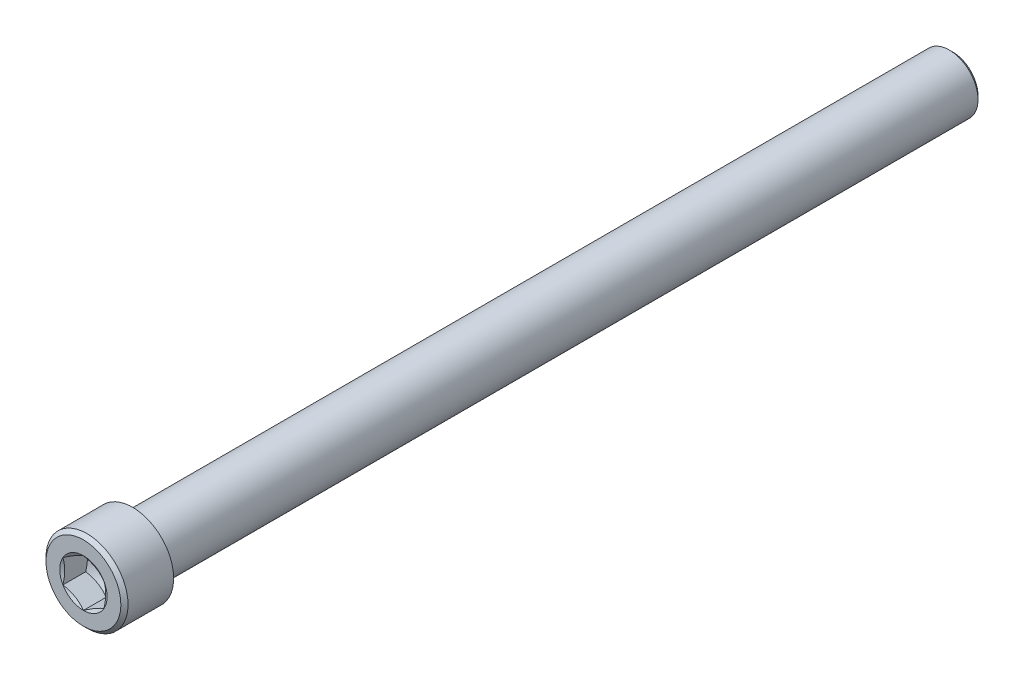
ISO-10303-21;
HEADER;
FILE_DESCRIPTION(('STEP AP214'),'2;1');
FILE_NAME('part.step','',(''),(''),'','','');
FILE_SCHEMA(('AUTOMOTIVE_DESIGN { 1 0 10303 214 1 1 1 1 }'));
ENDSEC;
DATA;
#1=APPLICATION_CONTEXT('core data for automotive mechanical design processes');
#2=APPLICATION_PROTOCOL_DEFINITION('international standard','automotive_design',2000,#1);
#3=PRODUCT_CONTEXT('',#1,'mechanical');
#4=PRODUCT('Part','Part','',(#3));
#5=PRODUCT_RELATED_PRODUCT_CATEGORY('part','',(#4));
#6=PRODUCT_DEFINITION_FORMATION('','',#4);
#7=PRODUCT_DEFINITION_CONTEXT('part definition',#1,'design');
#8=PRODUCT_DEFINITION('design','',#6,#7);
#9=PRODUCT_DEFINITION_SHAPE('','',#8);
#10=(LENGTH_UNIT() NAMED_UNIT(*) SI_UNIT(.MILLI.,.METRE.));
#11=(NAMED_UNIT(*) PLANE_ANGLE_UNIT() SI_UNIT($,.RADIAN.));
#12=(NAMED_UNIT(*) SI_UNIT($,.STERADIAN.) SOLID_ANGLE_UNIT());
#13=UNCERTAINTY_MEASURE_WITH_UNIT(LENGTH_MEASURE(1.E-05),#10,'distance_accuracy_value','');
#14=(GEOMETRIC_REPRESENTATION_CONTEXT(3) GLOBAL_UNCERTAINTY_ASSIGNED_CONTEXT((#13)) GLOBAL_UNIT_ASSIGNED_CONTEXT((#10,
#11,#12)) REPRESENTATION_CONTEXT('',''));
#15=CARTESIAN_POINT('',(0.,0.,0.));
#16=DIRECTION('',(0.,0.,1.));
#17=DIRECTION('',(1.,0.,0.));
#18=AXIS2_PLACEMENT_3D('',#15,#16,#17);
#19=CARTESIAN_POINT('',(0.,10.,12.));
#20=DIRECTION('',(0.,0.,-1.));
#21=DIRECTION('',(0.,1.,0.));
#22=AXIS2_PLACEMENT_3D('',#19,#20,#21);
#23=PLANE('',#22);
#24=CARTESIAN_POINT('',(0.,0.,12.));
#25=DIRECTION('',(0.,0.,-1.));
#26=DIRECTION('',(0.,1.,0.));
#27=AXIS2_PLACEMENT_3D('',#24,#25,#26);
#28=CIRCLE('',#27,9.12499999999997);
#29=CARTESIAN_POINT('',(0.,9.12499999999997,12.));
#30=VERTEX_POINT('',#29);
#31=EDGE_CURVE('E290',#30,#30,#28,.F.);
#32=ORIENTED_EDGE('',*,*,#31,.T.);
#33=EDGE_LOOP('',(#32));
#34=FACE_BOUND('',#33,.T.);
#35=CARTESIAN_POINT('',(0.,0.,12.));
#36=DIRECTION('',(0.,0.,-1.));
#37=DIRECTION('',(0.,1.,0.));
#38=AXIS2_PLACEMENT_3D('',#35,#36,#37);
#39=CIRCLE('',#38,5.77350269189626);
#40=CARTESIAN_POINT('',(0.,5.77350269189626,12.));
#41=VERTEX_POINT('',#40);
#42=CARTESIAN_POINT('',(-5.,2.88675134594813,12.));
#43=VERTEX_POINT('',#42);
#44=EDGE_CURVE('E114',#41,#43,#39,.F.);
#45=ORIENTED_EDGE('',*,*,#44,.F.);
#46=CARTESIAN_POINT('',(5.,2.88675134594813,12.));
#47=VERTEX_POINT('',#46);
#48=EDGE_CURVE('E103',#47,#41,#39,.F.);
#49=ORIENTED_EDGE('',*,*,#48,.F.);
#50=CARTESIAN_POINT('',(5.,-2.88675134594813,12.));
#51=VERTEX_POINT('',#50);
#52=EDGE_CURVE('E112',#51,#47,#39,.F.);
#53=ORIENTED_EDGE('',*,*,#52,.F.);
#54=CARTESIAN_POINT('',(0.,-5.77350269189626,12.));
#55=VERTEX_POINT('',#54);
#56=EDGE_CURVE('E468',#55,#51,#39,.F.);
#57=ORIENTED_EDGE('',*,*,#56,.F.);
#58=CARTESIAN_POINT('',(-5.,-2.88675134594813,12.));
#59=VERTEX_POINT('',#58);
#60=EDGE_CURVE('E142',#59,#55,#39,.F.);
#61=ORIENTED_EDGE('',*,*,#60,.F.);
#62=EDGE_CURVE('E141',#43,#59,#39,.F.);
#63=ORIENTED_EDGE('',*,*,#62,.F.);
#64=EDGE_LOOP('',(#45,#49,#53,#57,#61,#63));
#65=FACE_BOUND('',#64,.T.);
#66=ADVANCED_FACE('F47',(#34,#65),#23,.F.);
#67=CARTESIAN_POINT('',(0.,6.99999999999998,0.));
#68=DIRECTION('',(0.,0.,1.));
#69=DIRECTION('',(0.,-1.,0.));
#70=AXIS2_PLACEMENT_3D('',#67,#68,#69);
#71=PLANE('',#70);
#72=CARTESIAN_POINT('',(0.,0.,0.));
#73=DIRECTION('',(0.,0.,1.));
#74=DIRECTION('',(0.,-1.,0.));
#75=AXIS2_PLACEMENT_3D('',#72,#73,#74);
#76=CIRCLE('',#75,7.59999999999999);
#77=CARTESIAN_POINT('',(0.,-7.59999999999999,0.));
#78=VERTEX_POINT('',#77);
#79=EDGE_CURVE('E55',#78,#78,#76,.T.);
#80=ORIENTED_EDGE('',*,*,#79,.T.);
#81=EDGE_LOOP('',(#80));
#82=FACE_BOUND('',#81,.T.);
#83=CARTESIAN_POINT('',(0.,0.,0.));
#84=DIRECTION('',(0.,0.,1.));
#85=DIRECTION('',(0.,-1.,0.));
#86=AXIS2_PLACEMENT_3D('',#83,#84,#85);
#87=CIRCLE('',#86,10.);
#88=CARTESIAN_POINT('',(0.,-10.,0.));
#89=VERTEX_POINT('',#88);
#90=EDGE_CURVE('E447',#89,#89,#87,.T.);
#91=ORIENTED_EDGE('',*,*,#90,.F.);
#92=EDGE_LOOP('',(#91));
#93=FACE_BOUND('',#92,.T.);
#94=ADVANCED_FACE('F252',(#82,#93),#71,.F.);
#95=CARTESIAN_POINT('',(0.,0.,12.));
#96=DIRECTION('',(0.,0.,1.));
#97=DIRECTION('',(0.,-1.,0.));
#98=AXIS2_PLACEMENT_3D('',#95,#96,#97);
#99=CYLINDRICAL_SURFACE('',#98,6.99999999999999);
#100=CARTESIAN_POINT('',(0.,0.,-0.6));
#101=DIRECTION('',(0.,0.,1.));
#102=DIRECTION('',(0.,-1.,0.));
#103=AXIS2_PLACEMENT_3D('',#100,#101,#102);
#104=CIRCLE('',#103,6.99999999999999);
#105=CARTESIAN_POINT('',(0.,-6.99999999999999,-0.6));
#106=VERTEX_POINT('',#105);
#107=EDGE_CURVE('E12',#106,#106,#104,.F.);
#108=ORIENTED_EDGE('',*,*,#107,.T.);
#109=EDGE_LOOP('',(#108));
#110=FACE_BOUND('',#109,.T.);
#111=CARTESIAN_POINT('',(0.,0.,-199.125));
#112=DIRECTION('',(0.,0.,1.));
#113=DIRECTION('',(0.,-1.,0.));
#114=AXIS2_PLACEMENT_3D('',#111,#112,#113);
#115=CIRCLE('',#114,6.99999999999999);
#116=CARTESIAN_POINT('',(0.,-6.99999999999999,-199.125));
#117=VERTEX_POINT('',#116);
#118=EDGE_CURVE('E284',#117,#117,#115,.T.);
#119=ORIENTED_EDGE('',*,*,#118,.T.);
#120=EDGE_LOOP('',(#119));
#121=FACE_BOUND('',#120,.T.);
#122=ADVANCED_FACE('F258',(#110,#121),#99,.T.);
#123=CARTESIAN_POINT('',(0.,0.,-200.));
#124=DIRECTION('',(0.,0.,1.));
#125=DIRECTION('',(0.,-1.,0.));
#126=AXIS2_PLACEMENT_3D('',#123,#124,#125);
#127=PLANE('',#126);
#128=CARTESIAN_POINT('',(0.,0.,-200.));
#129=DIRECTION('',(0.,0.,1.));
#130=DIRECTION('',(0.,-1.,0.));
#131=AXIS2_PLACEMENT_3D('',#128,#129,#130);
#132=CIRCLE('',#131,6.12499999999999);
#133=CARTESIAN_POINT('',(0.,-6.12499999999999,-200.));
#134=VERTEX_POINT('',#133);
#135=EDGE_CURVE('E124',#134,#134,#132,.F.);
#136=ORIENTED_EDGE('',*,*,#135,.T.);
#137=EDGE_LOOP('',(#136));
#138=FACE_BOUND('',#137,.T.);
#139=ADVANCED_FACE('F263',(#138),#127,.F.);
#140=CARTESIAN_POINT('',(0.,0.,12.));
#141=DIRECTION('',(0.,0.,1.));
#142=DIRECTION('',(0.,-1.,0.));
#143=AXIS2_PLACEMENT_3D('',#140,#141,#142);
#144=CYLINDRICAL_SURFACE('',#143,10.);
#145=CARTESIAN_POINT('',(0.,0.,11.125));
#146=DIRECTION('',(0.,0.,-1.));
#147=DIRECTION('',(0.,1.,0.));
#148=AXIS2_PLACEMENT_3D('',#145,#146,#147);
#149=CIRCLE('',#148,10.);
#150=CARTESIAN_POINT('',(0.,10.,11.125));
#151=VERTEX_POINT('',#150);
#152=EDGE_CURVE('E286',#151,#151,#149,.T.);
#153=ORIENTED_EDGE('',*,*,#152,.T.);
#154=EDGE_LOOP('',(#153));
#155=FACE_BOUND('',#154,.T.);
#156=ORIENTED_EDGE('',*,*,#90,.T.);
#157=EDGE_LOOP('',(#156));
#158=FACE_BOUND('',#157,.T.);
#159=ADVANCED_FACE('F176',(#155,#158),#144,.T.);
#160=CARTESIAN_POINT('',(0.,0.,12.));
#161=DIRECTION('',(0.,0.,-1.));
#162=DIRECTION('',(0.,1.,0.));
#163=AXIS2_PLACEMENT_3D('',#160,#161,#162);
#164=CONICAL_SURFACE('',#163,9.12499999999997,0.785398163397448);
#165=ORIENTED_EDGE('',*,*,#152,.F.);
#166=EDGE_LOOP('',(#165));
#167=FACE_BOUND('',#166,.T.);
#168=ORIENTED_EDGE('',*,*,#31,.F.);
#169=EDGE_LOOP('',(#168));
#170=FACE_BOUND('',#169,.T.);
#171=ADVANCED_FACE('F270',(#167,#170),#164,.T.);
#172=CARTESIAN_POINT('',(0.,0.,-199.125));
#173=DIRECTION('',(0.,0.,1.));
#174=DIRECTION('',(0.,-1.,0.));
#175=AXIS2_PLACEMENT_3D('',#172,#173,#174);
#176=CONICAL_SURFACE('',#175,6.99999999999999,0.785398163397453);
#177=ORIENTED_EDGE('',*,*,#135,.F.);
#178=EDGE_LOOP('',(#177));
#179=FACE_BOUND('',#178,.T.);
#180=ORIENTED_EDGE('',*,*,#118,.F.);
#181=EDGE_LOOP('',(#180));
#182=FACE_BOUND('',#181,.T.);
#183=ADVANCED_FACE('F272',(#179,#182),#176,.T.);
#184=CARTESIAN_POINT('',(0.,0.,11.5534180126148));
#185=DIRECTION('',(0.,0.,1.));
#186=DIRECTION('',(0.,-1.,0.));
#187=AXIS2_PLACEMENT_3D('',#184,#185,#186);
#188=CONICAL_SURFACE('',#187,5.,1.04719755119659);
#189=ORIENTED_EDGE('',*,*,#44,.T.);
#190=CARTESIAN_POINT('',(-5.0002,2.88663587589429,12.0000666686666));
#191=CARTESIAN_POINT('',(-4.78046540547481,3.01349970319368,11.9268045802524));
#192=CARTESIAN_POINT('',(-4.55885141554042,3.14144859993849,11.8601693345329));
#193=CARTESIAN_POINT('',(-4.11178600454648,3.39956193532121,11.7438570036256));
#194=CARTESIAN_POINT('',(-3.88632664040922,3.52973095989718,11.6942210625306));
#195=CARTESIAN_POINT('',(-3.43816769477649,3.78847564779798,11.6169690380335));
#196=CARTESIAN_POINT('',(-3.2155379068958,3.91701101576052,11.5888383908983));
#197=CARTESIAN_POINT('',(-2.88081009815335,4.11026620624323,11.5636129345685));
#198=CARTESIAN_POINT('',(-2.76915780319493,4.17472868879311,11.5580314723843));
#199=CARTESIAN_POINT('',(-2.5457500293262,4.30371322717528,11.5526202293663));
#200=CARTESIAN_POINT('',(-2.43399455370968,4.36823528110589,11.552790270873));
#201=CARTESIAN_POINT('',(-2.12781576914935,4.54500768479195,11.5611716444068));
#202=CARTESIAN_POINT('',(-1.93349391403278,4.65719946015293,11.575247784512));
#203=CARTESIAN_POINT('',(-1.54613989800229,4.88083840557982,11.6198832697242));
#204=CARTESIAN_POINT('',(-1.35310909862842,4.99228478956021,11.6504578727623));
#205=CARTESIAN_POINT('',(-0.964974657525141,5.21637431361295,11.726886506236));
#206=CARTESIAN_POINT('',(-0.76992000135826,5.32898917185759,11.7730643914935));
#207=CARTESIAN_POINT('',(-0.382719654641229,5.55253939626498,11.8778698071067));
#208=CARTESIAN_POINT('',(-0.190569004591911,5.66347762579592,11.9364727160522));
#209=CARTESIAN_POINT('',(0.000200000000001268,5.7736181619501,12.0000666686666));
#210=B_SPLINE_CURVE_WITH_KNOTS('',3,(#190,#191,#192,#193,#194,#195,#196,#197,#198,#199,#200,
#201,#202,#203,#204,#205,#206,#207,#208,#209),.UNSPECIFIED.,.F.,.F.,(4,2,2,2,2,2,2,2,2,4),(0.,
0.792555841363093,1.58701660053334,2.36181537487281,2.74884076077326,3.13585419177296,
3.8096236259968,4.4840172390119,5.17336882348929,5.86136694793726),.UNSPECIFIED.);
#211=EDGE_CURVE('E118',#43,#41,#210,.T.);
#212=ORIENTED_EDGE('',*,*,#211,.T.);
#213=EDGE_LOOP('',(#189,#212));
#214=FACE_BOUND('',#213,.T.);
#215=ADVANCED_FACE('F119',(#214),#188,.F.);
#216=ORIENTED_EDGE('',*,*,#62,.T.);
#217=CARTESIAN_POINT('',(-5.,-7.65608998744864,13.9460515391656));
#218=CARTESIAN_POINT('',(-5.,-7.43656171400166,13.8399633507869));
#219=CARTESIAN_POINT('',(-5.,-7.21651440170021,13.7349297672308));
#220=CARTESIAN_POINT('',(-5.,-6.77510105921518,13.5275744462546));
#221=CARTESIAN_POINT('',(-5.,-6.55373480873052,13.4252531783605));
#222=CARTESIAN_POINT('',(-5.,-6.10820714710356,13.2233860911497));
#223=CARTESIAN_POINT('',(-5.,-5.88403698971124,13.1238595054321));
#224=CARTESIAN_POINT('',(-5.,-5.43385418074676,12.9290812454016));
#225=CARTESIAN_POINT('',(-5.,-5.20784162594278,12.8338293482572));
#226=CARTESIAN_POINT('',(-5.,-4.75080884782755,12.6476063218042));
#227=CARTESIAN_POINT('',(-5.,-4.51976121099505,12.5567021036135));
#228=CARTESIAN_POINT('',(-5.,-4.05494053422099,12.3820133155867));
#229=CARTESIAN_POINT('',(-5.,-3.82116719434024,12.2982295378624));
#230=CARTESIAN_POINT('',(-5.,-3.35100416711889,12.1400326449794));
#231=CARTESIAN_POINT('',(-5.,-3.11462125088187,12.0655996078401));
#232=CARTESIAN_POINT('',(-5.,-2.63849247870023,11.9285224064872));
#233=CARTESIAN_POINT('',(-5.,-2.3987477121033,11.8658745142117));
#234=CARTESIAN_POINT('',(-5.,-1.91574303714497,11.7554057666097));
#235=CARTESIAN_POINT('',(-5.,-1.67248221084099,11.7075888591734));
#236=CARTESIAN_POINT('',(-5.,-1.18299359688664,11.6300135684072));
#237=CARTESIAN_POINT('',(-5.,-0.936765806613277,11.6002552010432));
#238=CARTESIAN_POINT('',(-5.,-0.567032279323843,11.5710692142011));
#239=CARTESIAN_POINT('',(-5.,-0.444105297658535,11.5639143316747));
#240=CARTESIAN_POINT('',(-5.,-0.19805300523856,11.5548134648838));
#241=CARTESIAN_POINT('',(-5.,-0.0749276970802232,11.5528674129752));
#242=CARTESIAN_POINT('',(-5.,0.171257999892359,11.5542364829605));
#243=CARTESIAN_POINT('',(-5.,0.294318397227094,11.5575501269278));
#244=CARTESIAN_POINT('',(-5.,0.540192730788847,11.5693546098976));
#245=CARTESIAN_POINT('',(-5.,0.66300665426349,11.577845710185));
#246=CARTESIAN_POINT('',(-5.,0.960681872881672,11.6045243928901));
#247=CARTESIAN_POINT('',(-5.,1.1353143627994,11.6253069803131));
#248=CARTESIAN_POINT('',(-5.,1.48321675799389,11.6761836683375));
#249=CARTESIAN_POINT('',(-5.,1.65648647841236,11.7062790106048));
#250=CARTESIAN_POINT('',(-5.,2.00155426058699,11.7747168046263));
#251=CARTESIAN_POINT('',(-5.,2.17335067370373,11.8130674901012));
#252=CARTESIAN_POINT('',(-5.,2.51518168221053,11.8968463179998));
#253=CARTESIAN_POINT('',(-5.,2.6852163841931,11.9422740295288));
#254=CARTESIAN_POINT('',(-5.,3.02770318928891,12.0403057946691));
#255=CARTESIAN_POINT('',(-5.,3.2001124843531,12.0930583764387));
#256=CARTESIAN_POINT('',(-5.,3.54310870430175,12.2037757999174));
#257=CARTESIAN_POINT('',(-5.,3.71369679659712,12.2617370465219));
#258=CARTESIAN_POINT('',(-5.,4.05236610267971,12.3816745533433));
#259=CARTESIAN_POINT('',(-5.,4.22045602230053,12.4436263780412));
#260=CARTESIAN_POINT('',(-5.,4.55533171687445,12.5711662467529));
#261=CARTESIAN_POINT('',(-5.,4.72211693321412,12.6367557604026));
#262=CARTESIAN_POINT('',(-5.,4.88829623733352,12.703804270792));
#263=B_SPLINE_CURVE_WITH_KNOTS('',3,(#217,#218,#219,#220,#221,#222,#223,#224,#225,#226,#227,
#228,#229,#230,#231,#232,#233,#234,#235,#236,#237,#238,#239,#240,#241,#242,#243,#244,#245,#246,
#247,#248,#249,#250,#251,#252,#253,#254,#255,#256,#257,#258,#259,#260,#261,#262),.UNSPECIFIED.,
.F.,.F.,(4,2,2,2,2,2,2,2,2,2,2,2,2,2,2,2,2,2,2,2,2,2,4),(0.,0.731464740665352,1.46305528824909,
2.19883243307486,2.93457117856034,3.67934251246858,4.42419659013362,5.1674358087199,
5.91043951739339,6.65364083834807,7.39684281638516,7.76615414335457,8.13546067426611,
8.50466345177857,8.87388486298453,9.40118542949727,9.92855633110015,10.4564556797854,
10.9843228991235,11.525120280828,12.065547221064,12.6029322754131,13.1405360390025),.UNSPECIFIED.);
#264=EDGE_CURVE('E234',#59,#43,#263,.T.);
#265=ORIENTED_EDGE('',*,*,#264,.T.);
#266=EDGE_LOOP('',(#216,#265));
#267=FACE_BOUND('',#266,.T.);
#268=ADVANCED_FACE('F278',(#267),#188,.F.);
#269=ORIENTED_EDGE('',*,*,#60,.T.);
#270=CARTESIAN_POINT('',(0.000200000000001554,-5.77361816195009,12.0000666686666));
#271=CARTESIAN_POINT('',(-0.219534594525184,-5.64675433465071,11.9268045802524));
#272=CARTESIAN_POINT('',(-0.44114858445958,-5.5188054379059,11.8601693345329));
#273=CARTESIAN_POINT('',(-0.888213995453514,-5.26069210252318,11.7438570036256));
#274=CARTESIAN_POINT('',(-1.11367335959078,-5.13052307794721,11.6942210625306));
#275=CARTESIAN_POINT('',(-1.56183230522351,-4.87177839004641,11.6169690380335));
#276=CARTESIAN_POINT('',(-1.78446209310419,-4.74324302208387,11.5888383908983));
#277=CARTESIAN_POINT('',(-2.11918990184664,-4.54998783160116,11.5636129345685));
#278=CARTESIAN_POINT('',(-2.23084219680506,-4.48552534905128,11.5580314723843));
#279=CARTESIAN_POINT('',(-2.4542499706738,-4.35654081066911,11.5526202293663));
#280=CARTESIAN_POINT('',(-2.56600544629032,-4.2920187567385,11.552790270873));
#281=CARTESIAN_POINT('',(-2.87218423085064,-4.11524635305244,11.5611716444068));
#282=CARTESIAN_POINT('',(-3.06650608596722,-4.00305457769146,11.575247784512));
#283=CARTESIAN_POINT('',(-3.45386010199771,-3.77941563226457,11.6198832697242));
#284=CARTESIAN_POINT('',(-3.64689090137157,-3.66796924828418,11.6504578727623));
#285=CARTESIAN_POINT('',(-4.03502534247486,-3.44387972423144,11.726886506236));
#286=CARTESIAN_POINT('',(-4.23007999864174,-3.3312648659868,11.7730643914935));
#287=CARTESIAN_POINT('',(-4.61728034535877,-3.1077146415794,11.8778698071067));
#288=CARTESIAN_POINT('',(-4.80943099540808,-2.99677641204847,11.9364727160522));
#289=CARTESIAN_POINT('',(-5.0002,-2.88663587589429,12.0000666686666));
#290=B_SPLINE_CURVE_WITH_KNOTS('',3,(#270,#271,#272,#273,#274,#275,#276,#277,#278,#279,#280,
#281,#282,#283,#284,#285,#286,#287,#288,#289),.UNSPECIFIED.,.F.,.F.,(4,2,2,2,2,2,2,2,2,4),(0.,
0.792555841363094,1.58701660053334,2.36181537487281,2.74884076077326,3.13585419177296,
3.8096236259968,4.4840172390119,5.17336882348929,5.86136694793725),.UNSPECIFIED.);
#291=EDGE_CURVE('E228',#55,#59,#290,.T.);
#292=ORIENTED_EDGE('',*,*,#291,.T.);
#293=EDGE_LOOP('',(#269,#292));
#294=FACE_BOUND('',#293,.T.);
#295=ADVANCED_FACE('F355',(#294),#188,.F.);
#296=ORIENTED_EDGE('',*,*,#56,.T.);
#297=CARTESIAN_POINT('',(5.0002,-2.88663587589429,12.0000666686666));
#298=CARTESIAN_POINT('',(4.78046540547481,-3.01349970319368,11.9268045802524));
#299=CARTESIAN_POINT('',(4.55885141554042,-3.14144859993849,11.8601693345329));
#300=CARTESIAN_POINT('',(4.11178600454648,-3.39956193532121,11.7438570036256));
#301=CARTESIAN_POINT('',(3.88632664040922,-3.52973095989718,11.6942210625306));
#302=CARTESIAN_POINT('',(3.43816769477649,-3.78847564779798,11.6169690380335));
#303=CARTESIAN_POINT('',(3.2155379068958,-3.91701101576052,11.5888383908983));
#304=CARTESIAN_POINT('',(2.88081009815335,-4.11026620624323,11.5636129345685));
#305=CARTESIAN_POINT('',(2.76915780319493,-4.17472868879311,11.5580314723843));
#306=CARTESIAN_POINT('',(2.5457500293262,-4.30371322717528,11.5526202293663));
#307=CARTESIAN_POINT('',(2.43399455370968,-4.36823528110589,11.552790270873));
#308=CARTESIAN_POINT('',(2.12781576914936,-4.54500768479194,11.5611716444068));
#309=CARTESIAN_POINT('',(1.93349391403278,-4.65719946015293,11.575247784512));
#310=CARTESIAN_POINT('',(1.54613989800229,-4.88083840557981,11.6198832697242));
#311=CARTESIAN_POINT('',(1.35310909862843,-4.9922847895602,11.6504578727623));
#312=CARTESIAN_POINT('',(0.964974657525143,-5.21637431361295,11.726886506236));
#313=CARTESIAN_POINT('',(0.769920001358262,-5.32898917185759,11.7730643914935));
#314=CARTESIAN_POINT('',(0.382719654641231,-5.55253939626498,11.8778698071067));
#315=CARTESIAN_POINT('',(0.190569004591913,-5.66347762579592,11.9364727160522));
#316=CARTESIAN_POINT('',(-0.000199999999999501,-5.77361816195009,12.0000666686666));
#317=B_SPLINE_CURVE_WITH_KNOTS('',3,(#297,#298,#299,#300,#301,#302,#303,#304,#305,#306,#307,
#308,#309,#310,#311,#312,#313,#314,#315,#316),.UNSPECIFIED.,.F.,.F.,(4,2,2,2,2,2,2,2,2,4),(0.,
0.792555841363094,1.58701660053334,2.36181537487281,2.74884076077326,3.13585419177296,
3.8096236259968,4.4840172390119,5.17336882348929,5.86136694793725),.UNSPECIFIED.);
#318=EDGE_CURVE('E67',#51,#55,#317,.T.);
#319=ORIENTED_EDGE('',*,*,#318,.T.);
#320=EDGE_LOOP('',(#296,#319));
#321=FACE_BOUND('',#320,.T.);
#322=ADVANCED_FACE('F364',(#321),#188,.F.);
#323=ORIENTED_EDGE('',*,*,#52,.T.);
#324=CARTESIAN_POINT('',(5.,-7.65608998744864,13.9460515391656));
#325=CARTESIAN_POINT('',(5.,-7.43656171400165,13.8399633507869));
#326=CARTESIAN_POINT('',(5.,-7.21651440170021,13.7349297672308));
#327=CARTESIAN_POINT('',(5.,-6.77510105921518,13.5275744462546));
#328=CARTESIAN_POINT('',(5.,-6.55373480873052,13.4252531783605));
#329=CARTESIAN_POINT('',(5.,-6.10820714710356,13.2233860911497));
#330=CARTESIAN_POINT('',(5.,-5.88403698971124,13.1238595054321));
#331=CARTESIAN_POINT('',(5.,-5.43385418074677,12.9290812454016));
#332=CARTESIAN_POINT('',(5.,-5.20784162594278,12.8338293482572));
#333=CARTESIAN_POINT('',(5.,-4.75080884782756,12.6476063218042));
#334=CARTESIAN_POINT('',(5.,-4.51976121099505,12.5567021036135));
#335=CARTESIAN_POINT('',(5.,-4.05494053422099,12.3820133155867));
#336=CARTESIAN_POINT('',(5.,-3.82116719434024,12.2982295378625));
#337=CARTESIAN_POINT('',(5.,-3.35100416711889,12.1400326449794));
#338=CARTESIAN_POINT('',(5.,-3.11462125088187,12.0655996078401));
#339=CARTESIAN_POINT('',(5.,-2.63849247870023,11.9285224064872));
#340=CARTESIAN_POINT('',(5.,-2.3987477121033,11.8658745142117));
#341=CARTESIAN_POINT('',(5.,-1.91574303714496,11.7554057666097));
#342=CARTESIAN_POINT('',(5.,-1.67248221084099,11.7075888591734));
#343=CARTESIAN_POINT('',(5.,-1.18299359688663,11.6300135684072));
#344=CARTESIAN_POINT('',(5.,-0.936765806613274,11.6002552010432));
#345=CARTESIAN_POINT('',(5.,-0.567032279323839,11.5710692142011));
#346=CARTESIAN_POINT('',(5.,-0.444105297658531,11.5639143316747));
#347=CARTESIAN_POINT('',(5.,-0.198053005238556,11.5548134648838));
#348=CARTESIAN_POINT('',(5.,-0.0749276970802199,11.5528674129752));
#349=CARTESIAN_POINT('',(5.,0.171257999892362,11.5542364829605));
#350=CARTESIAN_POINT('',(5.,0.294318397227098,11.5575501269278));
#351=CARTESIAN_POINT('',(5.,0.54019273078885,11.5693546098976));
#352=CARTESIAN_POINT('',(5.,0.663006654263492,11.577845710185));
#353=CARTESIAN_POINT('',(5.,0.960681872881674,11.6045243928901));
#354=CARTESIAN_POINT('',(5.,1.1353143627994,11.6253069803131));
#355=CARTESIAN_POINT('',(5.,1.48321675799389,11.6761836683375));
#356=CARTESIAN_POINT('',(5.,1.65648647841236,11.7062790106048));
#357=CARTESIAN_POINT('',(5.,2.00155426058699,11.7747168046263));
#358=CARTESIAN_POINT('',(5.,2.17335067370372,11.8130674901012));
#359=CARTESIAN_POINT('',(5.,2.51518168221053,11.8968463179998));
#360=CARTESIAN_POINT('',(5.,2.68521638419309,11.9422740295288));
#361=CARTESIAN_POINT('',(5.,3.0277031892889,12.0403057946691));
#362=CARTESIAN_POINT('',(5.,3.2001124843531,12.0930583764387));
#363=CARTESIAN_POINT('',(5.,3.54310870430175,12.2037757999174));
#364=CARTESIAN_POINT('',(5.,3.71369679659712,12.2617370465219));
#365=CARTESIAN_POINT('',(5.,4.05236610267971,12.3816745533433));
#366=CARTESIAN_POINT('',(5.,4.22045602230053,12.4436263780412));
#367=CARTESIAN_POINT('',(5.,4.55533171687445,12.5711662467529));
#368=CARTESIAN_POINT('',(5.,4.72211693321412,12.6367557604026));
#369=CARTESIAN_POINT('',(5.,4.88829623733352,12.703804270792));
#370=B_SPLINE_CURVE_WITH_KNOTS('',3,(#324,#325,#326,#327,#328,#329,#330,#331,#332,#333,#334,
#335,#336,#337,#338,#339,#340,#341,#342,#343,#344,#345,#346,#347,#348,#349,#350,#351,#352,#353,
#354,#355,#356,#357,#358,#359,#360,#361,#362,#363,#364,#365,#366,#367,#368,#369),.UNSPECIFIED.,
.F.,.F.,(4,2,2,2,2,2,2,2,2,2,2,2,2,2,2,2,2,2,2,2,2,2,4),(0.,0.731464740665351,1.46305528824908,
2.19883243307486,2.93457117856033,3.67934251246857,4.42419659013361,5.16743580871989,
5.91043951739339,6.65364083834807,7.39684281638516,7.76615414335457,8.13546067426611,
8.50466345177857,8.87388486298453,9.40118542949727,9.92855633110015,10.4564556797854,
10.9843228991235,11.525120280828,12.065547221064,12.6029322754131,13.1405360390025),.UNSPECIFIED.);
#371=EDGE_CURVE('E61',#47,#51,#370,.F.);
#372=ORIENTED_EDGE('',*,*,#371,.T.);
#373=EDGE_LOOP('',(#323,#372));
#374=FACE_BOUND('',#373,.T.);
#375=ADVANCED_FACE('F373',(#374),#188,.F.);
#376=ORIENTED_EDGE('',*,*,#48,.T.);
#377=CARTESIAN_POINT('',(-0.000200000000000217,5.7736181619501,12.0000666686666));
#378=CARTESIAN_POINT('',(0.219534594525186,5.64675433465071,11.9268045802524));
#379=CARTESIAN_POINT('',(0.441148584459581,5.5188054379059,11.8601693345329));
#380=CARTESIAN_POINT('',(0.888213995453514,5.26069210252318,11.7438570036256));
#381=CARTESIAN_POINT('',(1.11367335959078,5.13052307794721,11.6942210625306));
#382=CARTESIAN_POINT('',(1.56183230522351,4.87177839004641,11.6169690380335));
#383=CARTESIAN_POINT('',(1.7844620931042,4.74324302208387,11.5888383908983));
#384=CARTESIAN_POINT('',(2.11918990184665,4.54998783160116,11.5636129345685));
#385=CARTESIAN_POINT('',(2.23084219680507,4.48552534905128,11.5580314723843));
#386=CARTESIAN_POINT('',(2.4542499706738,4.35654081066911,11.5526202293663));
#387=CARTESIAN_POINT('',(2.56600544629032,4.2920187567385,11.552790270873));
#388=CARTESIAN_POINT('',(2.87218423085064,4.11524635305244,11.5611716444068));
#389=CARTESIAN_POINT('',(3.06650608596722,4.00305457769146,11.575247784512));
#390=CARTESIAN_POINT('',(3.45386010199771,3.77941563226457,11.6198832697242));
#391=CARTESIAN_POINT('',(3.64689090137157,3.66796924828418,11.6504578727623));
#392=CARTESIAN_POINT('',(4.03502534247486,3.44387972423144,11.726886506236));
#393=CARTESIAN_POINT('',(4.23007999864174,3.3312648659868,11.7730643914935));
#394=CARTESIAN_POINT('',(4.61728034535877,3.10771464157941,11.8778698071067));
#395=CARTESIAN_POINT('',(4.80943099540809,2.99677641204847,11.9364727160522));
#396=CARTESIAN_POINT('',(5.0002,2.88663587589429,12.0000666686666));
#397=B_SPLINE_CURVE_WITH_KNOTS('',3,(#377,#378,#379,#380,#381,#382,#383,#384,#385,#386,#387,
#388,#389,#390,#391,#392,#393,#394,#395,#396),.UNSPECIFIED.,.F.,.F.,(4,2,2,2,2,2,2,2,2,4),(0.,
0.792555841363092,1.58701660053334,2.36181537487281,2.74884076077326,3.13585419177296,
3.8096236259968,4.4840172390119,5.17336882348929,5.86136694793725),.UNSPECIFIED.);
#398=EDGE_CURVE('E107',#41,#47,#397,.T.);
#399=ORIENTED_EDGE('',*,*,#398,.T.);
#400=EDGE_LOOP('',(#376,#399));
#401=FACE_BOUND('',#400,.T.);
#402=ADVANCED_FACE('F105',(#401),#188,.F.);
#403=CARTESIAN_POINT('',(0.,0.,3.11324865405189));
#404=DIRECTION('',(0.,0.,1.));
#405=DIRECTION('',(1.,0.,0.));
#406=AXIS2_PLACEMENT_3D('',#403,#404,#405);
#407=CONICAL_SURFACE('',#406,0.,1.0471975511966);
#408=CARTESIAN_POINT('',(5.0002,-2.88663587589429,6.44664865605183));
#409=CARTESIAN_POINT('',(4.78046540547481,-3.01349970319368,6.37338656763763));
#410=CARTESIAN_POINT('',(4.55885141554042,-3.14144859993849,6.30675132191809));
#411=CARTESIAN_POINT('',(4.11178600454648,-3.39956193532121,6.19043899101081));
#412=CARTESIAN_POINT('',(3.88632664040922,-3.52973095989718,6.14080304991579));
#413=CARTESIAN_POINT('',(3.43816769477649,-3.78847564779798,6.0635510254187));
#414=CARTESIAN_POINT('',(3.21553790689581,-3.91701101576052,6.03542037828349));
#415=CARTESIAN_POINT('',(2.88081009815336,-4.11026620624322,6.01019492195369));
#416=CARTESIAN_POINT('',(2.76915780319494,-4.17472868879311,6.00461345976949));
#417=CARTESIAN_POINT('',(2.5457500293262,-4.30371322717528,5.99920221675147));
#418=CARTESIAN_POINT('',(2.43399455370969,-4.36823528110589,5.9993722582582));
#419=CARTESIAN_POINT('',(2.12781576914936,-4.54500768479194,6.00775363179204));
#420=CARTESIAN_POINT('',(1.93349391403279,-4.65719946015292,6.02182977189725));
#421=CARTESIAN_POINT('',(1.54613989800229,-4.88083840557981,6.06646525710943));
#422=CARTESIAN_POINT('',(1.35310909862843,-4.9922847895602,6.09703986014751));
#423=CARTESIAN_POINT('',(0.964974657525146,-5.21637431361295,6.17346849362117));
#424=CARTESIAN_POINT('',(0.769920001358264,-5.32898917185759,6.21964637887868));
#425=CARTESIAN_POINT('',(0.382719654641232,-5.55253939626498,6.32445179449194));
#426=CARTESIAN_POINT('',(0.190569004591914,-5.66347762579591,6.38305470343737));
#427=CARTESIAN_POINT('',(-0.000199999999999081,-5.77361816195009,6.44664865605183));
#428=B_SPLINE_CURVE_WITH_KNOTS('',3,(#408,#409,#410,#411,#412,#413,#414,#415,#416,#417,#418,
#419,#420,#421,#422,#423,#424,#425,#426,#427),.UNSPECIFIED.,.F.,.F.,(4,2,2,2,2,2,2,2,2,4),(0.,
0.792555841363091,1.58701660053333,2.36181537487281,2.74884076077325,3.13585419177295,
3.80962362599679,4.48401723901189,5.17336882348928,5.86136694793725),.UNSPECIFIED.);
#429=CARTESIAN_POINT('',(5.,-2.88675134594813,6.4465819873852));
#430=VERTEX_POINT('',#429);
#431=CARTESIAN_POINT('',(0.,-5.77350269189626,6.4465819873852));
#432=VERTEX_POINT('',#431);
#433=EDGE_CURVE('E190',#430,#432,#428,.T.);
#434=ORIENTED_EDGE('',*,*,#433,.F.);
#435=CARTESIAN_POINT('',(5.,-7.71798195908827,8.4225877692592));
#436=CARTESIAN_POINT('',(5.,-7.49970384938774,8.31684955613426));
#437=CARTESIAN_POINT('',(5.,-7.28092032870476,8.21213656307534));
#438=CARTESIAN_POINT('',(5.,-6.84207314635018,8.00533908557017));
#439=CARTESIAN_POINT('',(5.,-6.62200928533468,7.90325502463477));
#440=CARTESIAN_POINT('',(5.,-6.17918315376836,7.70177322448573));
#441=CARTESIAN_POINT('',(5.,-5.95641269360618,7.60239342182408));
#442=CARTESIAN_POINT('',(5.,-5.50908481382186,7.40775599483657));
#443=CARTESIAN_POINT('',(5.,-5.28452748085774,7.31249817203211));
#444=CARTESIAN_POINT('',(5.,-4.82657046421065,7.12444529954391));
#445=CARTESIAN_POINT('',(5.,-4.59310603722614,7.03180704880942));
#446=CARTESIAN_POINT('',(5.,-4.12343378353533,6.85362983870601));
#447=CARTESIAN_POINT('',(5.,-3.88722565122731,6.76809167897881));
#448=CARTESIAN_POINT('',(5.,-3.41214208875745,6.60638364727848));
#449=CARTESIAN_POINT('',(5.,-3.17327325072964,6.53019460448891));
#450=CARTESIAN_POINT('',(5.,-2.69211227036572,6.38965132467951));
#451=CARTESIAN_POINT('',(5.,-2.44982124095973,6.32529333135543));
#452=CARTESIAN_POINT('',(5.,-1.96281641516125,6.21181328196226));
#453=CARTESIAN_POINT('',(5.,-1.71811906730466,6.16262194662061));
#454=CARTESIAN_POINT('',(5.,-1.22572466862996,6.08235290687548));
#455=CARTESIAN_POINT('',(5.,-0.978027953890786,6.05127319189014));
#456=CARTESIAN_POINT('',(5.,-0.484068230438677,6.01011095987818));
#457=CARTESIAN_POINT('',(5.,-0.237827906493212,5.99976291252161));
#458=CARTESIAN_POINT('',(5.,0.254662804202139,6.00024526906332));
#459=CARTESIAN_POINT('',(5.,0.500913190421068,6.01107718018073));
#460=CARTESIAN_POINT('',(5.,0.919771265930183,6.0467554283319));
#461=CARTESIAN_POINT('',(5.,1.09283273745398,6.06657048064079));
#462=CARTESIAN_POINT('',(5.,1.43765967507733,6.11541146642548));
#463=CARTESIAN_POINT('',(5.,1.6094249610368,6.14443865689144));
#464=CARTESIAN_POINT('',(5.,2.12253233768447,6.24380732107773));
#465=CARTESIAN_POINT('',(5.,2.46152279862364,6.32642017633757));
#466=CARTESIAN_POINT('',(5.,2.96891814645914,6.46943410152972));
#467=CARTESIAN_POINT('',(5.,3.13995004131111,6.52104080559582));
#468=CARTESIAN_POINT('',(5.,3.48034882174402,6.62952941360672));
#469=CARTESIAN_POINT('',(5.,3.6497156930988,6.68641136258061));
#470=CARTESIAN_POINT('',(5.,3.98685300284085,6.80454695898974));
#471=CARTESIAN_POINT('',(5.,4.15462385512187,6.86579943594442));
#472=CARTESIAN_POINT('',(5.,4.4887736424069,6.99195640284236));
#473=CARTESIAN_POINT('',(5.,4.65515264399207,7.05686071693395));
#474=CARTESIAN_POINT('',(5.,5.03780012825315,7.21019970238217));
#475=CARTESIAN_POINT('',(5.,5.25363308256088,7.29971897518728));
#476=CARTESIAN_POINT('',(5.,5.68353815235805,7.48290118195396));
#477=CARTESIAN_POINT('',(5.,5.8976101743302,7.57656433431986));
#478=CARTESIAN_POINT('',(5.,6.3243108340175,7.76723069183951));
#479=CARTESIAN_POINT('',(5.,6.53693916495857,7.86423458182943));
#480=CARTESIAN_POINT('',(5.,6.96094691622292,8.06093838607697));
#481=CARTESIAN_POINT('',(5.,7.17232631187785,8.16063835337072));
#482=CARTESIAN_POINT('',(5.,7.8051822136081,8.46315747608118));
#483=CARTESIAN_POINT('',(5.,8.22508620597033,8.66926444645079));
#484=CARTESIAN_POINT('',(5.,9.06189522651103,9.08747898584437));
#485=CARTESIAN_POINT('',(5.,9.47880014662741,9.29958676974378));
#486=CARTESIAN_POINT('',(5.,10.1030029562804,9.62124146899319));
#487=CARTESIAN_POINT('',(5.,10.3111335898385,9.72917688277552));
#488=CARTESIAN_POINT('',(5.,10.7269054145621,9.94597692763215));
#489=CARTESIAN_POINT('',(5.,10.9345466147258,10.0548415414504));
#490=CARTESIAN_POINT('',(5.,11.5568548319544,10.3826356447221));
#491=CARTESIAN_POINT('',(5.,11.9708932246947,10.6027585506306));
#492=CARTESIAN_POINT('',(5.,12.7975006829974,11.0452965745165));
#493=CARTESIAN_POINT('',(5.,13.2100703268185,11.2677106143695));
#494=CARTESIAN_POINT('',(5.,14.0342065020329,11.7143889402175));
#495=CARTESIAN_POINT('',(5.,14.4457730326101,11.938653227717));
#496=CARTESIAN_POINT('',(5.,15.5473863726793,12.5414417229313));
#497=CARTESIAN_POINT('',(5.,16.2367129508959,12.9212816061574));
#498=CARTESIAN_POINT('',(5.,17.6138948181901,13.6838290534536));
#499=CARTESIAN_POINT('',(5.,18.3017499005469,14.0665369902757));
#500=CARTESIAN_POINT('',(5.,19.6733327875707,14.8323143050826));
#501=CARTESIAN_POINT('',(5.,20.3570655235749,15.2153748563325));
#502=CARTESIAN_POINT('',(5.,21.7235737830401,15.982974633772));
#503=CARTESIAN_POINT('',(5.,22.4063494279562,16.3675136436841));
#504=CARTESIAN_POINT('',(5.,23.0888270217218,16.752578222607));
#505=B_SPLINE_CURVE_WITH_KNOTS('',3,(#435,#436,#437,#438,#439,#440,#441,#442,#443,#444,#445,
#446,#447,#448,#449,#450,#451,#452,#453,#454,#455,#456,#457,#458,#459,#460,#461,#462,#463,#464,
#465,#466,#467,#468,#469,#470,#471,#472,#473,#474,#475,#476,#477,#478,#479,#480,#481,#482,#483,
#484,#485,#486,#487,#488,#489,#490,#491,#492,#493,#494,#495,#496,#497,#498,#499,#500,#501,#502,
#503,#504),.UNSPECIFIED.,.F.,.F.,(4,2,2,2,2,2,2,2,2,2,2,2,2,2,2,2,2,2,2,2,2,2,2,2,2,2,2,2,2,2,2,
2,2,2,4),(0.,0.727630661032152,1.4553778164495,2.18714166170194,2.91887023228958,
3.67229766078562,4.42580982859819,5.17775010492593,5.92945122975906,6.67766599541985,
7.42579768547945,8.16428446118443,8.90282379137951,9.42514706179465,9.94754163354009,
10.9928202698386,11.5287200389915,12.0646243829661,12.6003857400625,13.1361213199888,
13.8370477196061,14.5380111058579,15.2391190519251,15.9402407999459,17.3434398523098,
18.7466892137879,19.4500474635745,20.1533926797194,21.5601278282294,22.9662287856665,
24.3723308865982,26.7334735397885,29.0949285776459,31.4461031797255,33.796946016039),.UNSPECIFIED.);
#506=CARTESIAN_POINT('',(5.,2.88675134594813,6.4465819873852));
#507=VERTEX_POINT('',#506);
#508=EDGE_CURVE('E197',#507,#430,#505,.F.);
#509=ORIENTED_EDGE('',*,*,#508,.F.);
#510=CARTESIAN_POINT('',(-0.000200000000000016,5.77361816195009,6.44664865605183));
#511=CARTESIAN_POINT('',(0.219534594525185,5.6467543346507,6.37338656763763));
#512=CARTESIAN_POINT('',(0.441148584459581,5.5188054379059,6.30675132191809));
#513=CARTESIAN_POINT('',(0.888213995453513,5.26069210252318,6.19043899101081));
#514=CARTESIAN_POINT('',(1.11367335959077,5.13052307794721,6.14080304991579));
#515=CARTESIAN_POINT('',(1.56183230522351,4.87177839004641,6.0635510254187));
#516=CARTESIAN_POINT('',(1.78446209310419,4.74324302208387,6.03542037828349));
#517=CARTESIAN_POINT('',(2.11918990184664,4.54998783160116,6.01019492195369));
#518=CARTESIAN_POINT('',(2.23084219680506,4.48552534905128,6.00461345976949));
#519=CARTESIAN_POINT('',(2.4542499706738,4.35654081066911,5.99920221675147));
#520=CARTESIAN_POINT('',(2.56600544629031,4.2920187567385,5.99937225825821));
#521=CARTESIAN_POINT('',(2.87218423085064,4.11524635305244,6.00775363179204));
#522=CARTESIAN_POINT('',(3.06650608596721,4.00305457769146,6.02182977189725));
#523=CARTESIAN_POINT('',(3.4538601019977,3.77941563226457,6.06646525710943));
#524=CARTESIAN_POINT('',(3.64689090137157,3.66796924828419,6.09703986014751));
#525=CARTESIAN_POINT('',(4.03502534247485,3.44387972423144,6.17346849362117));
#526=CARTESIAN_POINT('',(4.23007999864173,3.3312648659868,6.21964637887868));
#527=CARTESIAN_POINT('',(4.61728034535877,3.10771464157941,6.32445179449194));
#528=CARTESIAN_POINT('',(4.80943099540808,2.99677641204847,6.38305470343738));
#529=CARTESIAN_POINT('',(5.0002,2.88663587589429,6.44664865605183));
#530=B_SPLINE_CURVE_WITH_KNOTS('',3,(#510,#511,#512,#513,#514,#515,#516,#517,#518,#519,#520,
#521,#522,#523,#524,#525,#526,#527,#528,#529),.UNSPECIFIED.,.F.,.F.,(4,2,2,2,2,2,2,2,2,4),(0.,
0.79255584136309,1.58701660053333,2.3618153748728,2.74884076077325,3.13585419177295,
3.80962362599679,4.48401723901189,5.17336882348928,5.86136694793725),.UNSPECIFIED.);
#531=CARTESIAN_POINT('',(0.,5.77350269189626,6.4465819873852));
#532=VERTEX_POINT('',#531);
#533=EDGE_CURVE('E204',#532,#507,#530,.T.);
#534=ORIENTED_EDGE('',*,*,#533,.F.);
#535=CARTESIAN_POINT('',(-5.0002,2.88663587589429,6.44664865605183));
#536=CARTESIAN_POINT('',(-4.78046540547482,3.01349970319368,6.37338656763764));
#537=CARTESIAN_POINT('',(-4.55885141554042,3.14144859993849,6.30675132191809));
#538=CARTESIAN_POINT('',(-4.11178600454649,3.39956193532121,6.19043899101081));
#539=CARTESIAN_POINT('',(-3.88632664040923,3.52973095989718,6.14080304991579));
#540=CARTESIAN_POINT('',(-3.43816769477649,3.78847564779798,6.0635510254187));
#541=CARTESIAN_POINT('',(-3.21553790689581,3.91701101576052,6.03542037828349));
#542=CARTESIAN_POINT('',(-2.88081009815336,4.11026620624322,6.01019492195369));
#543=CARTESIAN_POINT('',(-2.76915780319494,4.17472868879311,6.00461345976949));
#544=CARTESIAN_POINT('',(-2.5457500293262,4.30371322717528,5.99920221675147));
#545=CARTESIAN_POINT('',(-2.43399455370969,4.36823528110589,5.99937225825821));
#546=CARTESIAN_POINT('',(-2.12781576914936,4.54500768479194,6.00775363179204));
#547=CARTESIAN_POINT('',(-1.93349391403279,4.65719946015292,6.02182977189725));
#548=CARTESIAN_POINT('',(-1.54613989800229,4.88083840557981,6.06646525710943));
#549=CARTESIAN_POINT('',(-1.35310909862843,4.9922847895602,6.09703986014751));
#550=CARTESIAN_POINT('',(-0.964974657525145,5.21637431361295,6.17346849362117));
#551=CARTESIAN_POINT('',(-0.769920001358264,5.32898917185759,6.21964637887868));
#552=CARTESIAN_POINT('',(-0.382719654641232,5.55253939626498,6.32445179449194));
#553=CARTESIAN_POINT('',(-0.190569004591914,5.66347762579592,6.38305470343737));
#554=CARTESIAN_POINT('',(0.0001999999999995,5.7736181619501,6.44664865605183));
#555=B_SPLINE_CURVE_WITH_KNOTS('',3,(#535,#536,#537,#538,#539,#540,#541,#542,#543,#544,#545,
#546,#547,#548,#549,#550,#551,#552,#553,#554),.UNSPECIFIED.,.F.,.F.,(4,2,2,2,2,2,2,2,2,4),(0.,
0.79255584136309,1.58701660053333,2.36181537487281,2.74884076077325,3.13585419177295,
3.80962362599679,4.48401723901189,5.17336882348929,5.86136694793725),.UNSPECIFIED.);
#556=CARTESIAN_POINT('',(-5.,2.88675134594813,6.44658198738521));
#557=VERTEX_POINT('',#556);
#558=EDGE_CURVE('E135',#557,#532,#555,.T.);
#559=ORIENTED_EDGE('',*,*,#558,.F.);
#560=CARTESIAN_POINT('',(-5.,-7.71798195908827,8.4225877692592));
#561=CARTESIAN_POINT('',(-5.,-7.49970384938774,8.31684955613426));
#562=CARTESIAN_POINT('',(-5.,-7.28092032870476,8.21213656307534));
#563=CARTESIAN_POINT('',(-5.,-6.84207314635019,8.00533908557017));
#564=CARTESIAN_POINT('',(-5.,-6.62200928533468,7.90325502463477));
#565=CARTESIAN_POINT('',(-5.,-6.17918315376836,7.70177322448573));
#566=CARTESIAN_POINT('',(-5.,-5.95641269360618,7.60239342182408));
#567=CARTESIAN_POINT('',(-5.,-5.50908481382186,7.40775599483657));
#568=CARTESIAN_POINT('',(-5.,-5.28452748085774,7.31249817203211));
#569=CARTESIAN_POINT('',(-5.,-4.82657046421065,7.12444529954391));
#570=CARTESIAN_POINT('',(-5.,-4.59310603722613,7.03180704880942));
#571=CARTESIAN_POINT('',(-5.,-4.12343378353533,6.85362983870601));
#572=CARTESIAN_POINT('',(-5.,-3.88722565122731,6.76809167897881));
#573=CARTESIAN_POINT('',(-5.,-3.41214208875745,6.60638364727848));
#574=CARTESIAN_POINT('',(-5.,-3.17327325072964,6.53019460448891));
#575=CARTESIAN_POINT('',(-5.,-2.69211227036573,6.38965132467951));
#576=CARTESIAN_POINT('',(-5.,-2.44982124095973,6.32529333135542));
#577=CARTESIAN_POINT('',(-5.,-1.96281641516125,6.21181328196226));
#578=CARTESIAN_POINT('',(-5.,-1.71811906730466,6.16262194662062));
#579=CARTESIAN_POINT('',(-5.,-1.22572466862996,6.08235290687549));
#580=CARTESIAN_POINT('',(-5.,-0.978027953890788,6.05127319189014));
#581=CARTESIAN_POINT('',(-5.,-0.484068230438679,6.01011095987818));
#582=CARTESIAN_POINT('',(-5.,-0.237827906493213,5.99976291252161));
#583=CARTESIAN_POINT('',(-5.,0.254662804202138,6.00024526906332));
#584=CARTESIAN_POINT('',(-5.,0.500913190421067,6.01107718018073));
#585=CARTESIAN_POINT('',(-5.,0.919771265930182,6.0467554283319));
#586=CARTESIAN_POINT('',(-5.,1.09283273745398,6.06657048064079));
#587=CARTESIAN_POINT('',(-5.,1.43765967507733,6.11541146642548));
#588=CARTESIAN_POINT('',(-5.,1.6094249610368,6.14443865689145));
#589=CARTESIAN_POINT('',(-5.,2.12253233768447,6.24380732107773));
#590=CARTESIAN_POINT('',(-5.,2.46152279862364,6.32642017633757));
#591=CARTESIAN_POINT('',(-5.,2.96891814645914,6.46943410152972));
#592=CARTESIAN_POINT('',(-5.,3.13995004131111,6.52104080559582));
#593=CARTESIAN_POINT('',(-5.,3.48034882174402,6.62952941360672));
#594=CARTESIAN_POINT('',(-5.,3.6497156930988,6.68641136258061));
#595=CARTESIAN_POINT('',(-5.,3.98685300284084,6.80454695898974));
#596=CARTESIAN_POINT('',(-5.,4.15462385512187,6.86579943594442));
#597=CARTESIAN_POINT('',(-5.,4.4887736424069,6.99195640284236));
#598=CARTESIAN_POINT('',(-5.,4.65515264399207,7.05686071693395));
#599=CARTESIAN_POINT('',(-5.,5.03780012825315,7.21019970238217));
#600=CARTESIAN_POINT('',(-5.,5.25363308256088,7.29971897518728));
#601=CARTESIAN_POINT('',(-5.,5.68353815235805,7.48290118195396));
#602=CARTESIAN_POINT('',(-5.,5.89761017433019,7.57656433431986));
#603=CARTESIAN_POINT('',(-5.,6.3243108340175,7.76723069183951));
#604=CARTESIAN_POINT('',(-5.,6.53693916495856,7.86423458182942));
#605=CARTESIAN_POINT('',(-5.,6.96094691622291,8.06093838607697));
#606=CARTESIAN_POINT('',(-5.,7.17232631187784,8.16063835337072));
#607=CARTESIAN_POINT('',(-5.,7.80518221360809,8.46315747608118));
#608=CARTESIAN_POINT('',(-5.,8.22508620597033,8.66926444645079));
#609=CARTESIAN_POINT('',(-5.,9.06189522651103,9.08747898584437));
#610=CARTESIAN_POINT('',(-5.,9.4788001466274,9.29958676974378));
#611=CARTESIAN_POINT('',(-5.,10.1030029562804,9.62124146899319));
#612=CARTESIAN_POINT('',(-5.,10.3111335898385,9.72917688277552));
#613=CARTESIAN_POINT('',(-5.,10.726905414562,9.94597692763214));
#614=CARTESIAN_POINT('',(-5.,10.9345466147258,10.0548415414504));
#615=CARTESIAN_POINT('',(-5.,11.5568548319544,10.3826356447221));
#616=CARTESIAN_POINT('',(-5.,11.9708932246947,10.6027585506306));
#617=CARTESIAN_POINT('',(-5.,12.7975006829974,11.0452965745165));
#618=CARTESIAN_POINT('',(-5.,13.2100703268185,11.2677106143695));
#619=CARTESIAN_POINT('',(-5.,14.0342065020328,11.7143889402175));
#620=CARTESIAN_POINT('',(-5.,14.4457730326101,11.938653227717));
#621=CARTESIAN_POINT('',(-5.,15.5473863726793,12.5414417229313));
#622=CARTESIAN_POINT('',(-5.,16.2367129508959,12.9212816061574));
#623=CARTESIAN_POINT('',(-5.,17.6138948181901,13.6838290534536));
#624=CARTESIAN_POINT('',(-5.00000000000001,18.3017499005469,14.0665369902757));
#625=CARTESIAN_POINT('',(-5.00000000000001,19.6733327875707,14.8323143050826));
#626=CARTESIAN_POINT('',(-5.00000000000001,20.3570655235749,15.2153748563325));
#627=CARTESIAN_POINT('',(-5.00000000000001,21.7235737830401,15.982974633772));
#628=CARTESIAN_POINT('',(-5.00000000000001,22.4063494279562,16.3675136436841));
#629=CARTESIAN_POINT('',(-5.00000000000001,23.0888270217218,16.752578222607));
#630=B_SPLINE_CURVE_WITH_KNOTS('',3,(#560,#561,#562,#563,#564,#565,#566,#567,#568,#569,#570,
#571,#572,#573,#574,#575,#576,#577,#578,#579,#580,#581,#582,#583,#584,#585,#586,#587,#588,#589,
#590,#591,#592,#593,#594,#595,#596,#597,#598,#599,#600,#601,#602,#603,#604,#605,#606,#607,#608,
#609,#610,#611,#612,#613,#614,#615,#616,#617,#618,#619,#620,#621,#622,#623,#624,#625,#626,#627,
#628,#629),.UNSPECIFIED.,.F.,.F.,(4,2,2,2,2,2,2,2,2,2,2,2,2,2,2,2,2,2,2,2,2,2,2,2,2,2,2,2,2,2,2,
2,2,2,4),(0.,0.72763066103215,1.4553778164495,2.18714166170194,2.91887023228958,
3.67229766078563,4.42580982859819,5.17775010492593,5.92945122975906,6.67766599541985,
7.42579768547945,8.16428446118443,8.90282379137951,9.42514706179466,9.94754163354009,
10.9928202698386,11.5287200389915,12.0646243829661,12.6003857400625,13.1361213199888,
13.8370477196061,14.5380111058579,15.2391190519251,15.9402407999459,17.3434398523098,
18.7466892137879,19.4500474635745,20.1533926797194,21.5601278282294,22.9662287856665,
24.3723308865981,26.7334735397885,29.0949285776459,31.4461031797255,33.796946016039),.UNSPECIFIED.);
#631=CARTESIAN_POINT('',(-5.,-2.88675134594813,6.4465819873852));
#632=VERTEX_POINT('',#631);
#633=EDGE_CURVE('E151',#632,#557,#630,.T.);
#634=ORIENTED_EDGE('',*,*,#633,.F.);
#635=CARTESIAN_POINT('',(0.000200000000000434,-5.77361816195009,6.44664865605183));
#636=CARTESIAN_POINT('',(-0.219534594525185,-5.64675433465071,6.37338656763763));
#637=CARTESIAN_POINT('',(-0.441148584459581,-5.5188054379059,6.30675132191809));
#638=CARTESIAN_POINT('',(-0.888213995453513,-5.26069210252318,6.19043899101081));
#639=CARTESIAN_POINT('',(-1.11367335959077,-5.13052307794721,6.14080304991579));
#640=CARTESIAN_POINT('',(-1.56183230522351,-4.87177839004641,6.0635510254187));
#641=CARTESIAN_POINT('',(-1.78446209310419,-4.74324302208387,6.03542037828349));
#642=CARTESIAN_POINT('',(-2.11918990184664,-4.54998783160116,6.01019492195369));
#643=CARTESIAN_POINT('',(-2.23084219680506,-4.48552534905128,6.00461345976948));
#644=CARTESIAN_POINT('',(-2.4542499706738,-4.35654081066911,5.99920221675147));
#645=CARTESIAN_POINT('',(-2.56600544629031,-4.2920187567385,5.99937225825821));
#646=CARTESIAN_POINT('',(-2.87218423085064,-4.11524635305244,6.00775363179204));
#647=CARTESIAN_POINT('',(-3.06650608596721,-4.00305457769146,6.02182977189725));
#648=CARTESIAN_POINT('',(-3.4538601019977,-3.77941563226457,6.06646525710943));
#649=CARTESIAN_POINT('',(-3.64689090137157,-3.66796924828418,6.09703986014751));
#650=CARTESIAN_POINT('',(-4.03502534247485,-3.44387972423144,6.17346849362116));
#651=CARTESIAN_POINT('',(-4.23007999864173,-3.3312648659868,6.21964637887868));
#652=CARTESIAN_POINT('',(-4.61728034535877,-3.10771464157941,6.32445179449194));
#653=CARTESIAN_POINT('',(-4.80943099540808,-2.99677641204847,6.38305470343738));
#654=CARTESIAN_POINT('',(-5.0002,-2.88663587589429,6.44664865605183));
#655=B_SPLINE_CURVE_WITH_KNOTS('',3,(#635,#636,#637,#638,#639,#640,#641,#642,#643,#644,#645,
#646,#647,#648,#649,#650,#651,#652,#653,#654),.UNSPECIFIED.,.F.,.F.,(4,2,2,2,2,2,2,2,2,4),(0.,
0.79255584136309,1.58701660053333,2.3618153748728,2.74884076077325,3.13585419177295,
3.80962362599679,4.48401723901189,5.17336882348928,5.86136694793725),.UNSPECIFIED.);
#656=EDGE_CURVE('E160',#432,#632,#655,.T.);
#657=ORIENTED_EDGE('',*,*,#656,.F.);
#658=EDGE_LOOP('',(#434,#509,#534,#559,#634,#657));
#659=FACE_BOUND('',#658,.T.);
#660=CARTESIAN_POINT('',(0.,0.,3.11324865405189));
#661=VERTEX_POINT('',#660);
#662=VERTEX_LOOP('',#661);
#663=FACE_BOUND('',#662,.T.);
#664=ADVANCED_FACE('F170',(#659,#663),#407,.F.);
#665=CARTESIAN_POINT('',(0.,5.77350269189626,-200.001));
#666=DIRECTION('',(-0.5,0.866025403784439,0.));
#667=DIRECTION('',(-0.866025403784439,-0.5,0.));
#668=AXIS2_PLACEMENT_3D('',#665,#666,#667);
#669=PLANE('',#668);
#670=ORIENTED_EDGE('',*,*,#211,.F.);
#671=DIRECTION('',(0.,0.,1.));
#672=VECTOR('',#671,1.);
#673=CARTESIAN_POINT('',(-5.,2.88675134594813,-200.001));
#674=LINE('',#673,#672);
#675=EDGE_CURVE('E136',#557,#43,#674,.T.);
#676=ORIENTED_EDGE('',*,*,#675,.F.);
#677=ORIENTED_EDGE('',*,*,#558,.T.);
#678=DIRECTION('',(0.,0.,1.));
#679=VECTOR('',#678,1.);
#680=CARTESIAN_POINT('',(0.,5.77350269189626,-200.001));
#681=LINE('',#680,#679);
#682=EDGE_CURVE('E129',#532,#41,#681,.T.);
#683=ORIENTED_EDGE('',*,*,#682,.T.);
#684=EDGE_LOOP('',(#670,#676,#677,#683));
#685=FACE_BOUND('',#684,.T.);
#686=ADVANCED_FACE('F134',(#685),#669,.F.);
#687=CARTESIAN_POINT('',(-5.,2.88675134594813,-200.001));
#688=DIRECTION('',(-1.,0.,0.));
#689=DIRECTION('',(0.,-1.,0.));
#690=AXIS2_PLACEMENT_3D('',#687,#688,#689);
#691=PLANE('',#690);
#692=ORIENTED_EDGE('',*,*,#264,.F.);
#693=DIRECTION('',(0.,0.,1.));
#694=VECTOR('',#693,1.);
#695=CARTESIAN_POINT('',(-5.,-2.88675134594813,-200.001));
#696=LINE('',#695,#694);
#697=EDGE_CURVE('E460',#632,#59,#696,.T.);
#698=ORIENTED_EDGE('',*,*,#697,.F.);
#699=ORIENTED_EDGE('',*,*,#633,.T.);
#700=ORIENTED_EDGE('',*,*,#675,.T.);
#701=EDGE_LOOP('',(#692,#698,#699,#700));
#702=FACE_BOUND('',#701,.T.);
#703=ADVANCED_FACE('F167',(#702),#691,.F.);
#704=CARTESIAN_POINT('',(-5.,-2.88675134594813,-200.001));
#705=DIRECTION('',(-0.5,-0.866025403784439,0.));
#706=DIRECTION('',(0.866025403784439,-0.5,0.));
#707=AXIS2_PLACEMENT_3D('',#704,#705,#706);
#708=PLANE('',#707);
#709=ORIENTED_EDGE('',*,*,#291,.F.);
#710=DIRECTION('',(0.,0.,1.));
#711=VECTOR('',#710,1.);
#712=CARTESIAN_POINT('',(0.,-5.77350269189626,-200.001));
#713=LINE('',#712,#711);
#714=EDGE_CURVE('E455',#432,#55,#713,.T.);
#715=ORIENTED_EDGE('',*,*,#714,.F.);
#716=ORIENTED_EDGE('',*,*,#656,.T.);
#717=ORIENTED_EDGE('',*,*,#697,.T.);
#718=EDGE_LOOP('',(#709,#715,#716,#717));
#719=FACE_BOUND('',#718,.T.);
#720=ADVANCED_FACE('F239',(#719),#708,.F.);
#721=CARTESIAN_POINT('',(0.,-5.77350269189626,-200.001));
#722=DIRECTION('',(0.5,-0.866025403784439,0.));
#723=DIRECTION('',(0.866025403784439,0.5,0.));
#724=AXIS2_PLACEMENT_3D('',#721,#722,#723);
#725=PLANE('',#724);
#726=ORIENTED_EDGE('',*,*,#318,.F.);
#727=DIRECTION('',(0.,0.,1.));
#728=VECTOR('',#727,1.);
#729=CARTESIAN_POINT('',(5.,-2.88675134594813,-200.001));
#730=LINE('',#729,#728);
#731=EDGE_CURVE('E454',#430,#51,#730,.T.);
#732=ORIENTED_EDGE('',*,*,#731,.F.);
#733=ORIENTED_EDGE('',*,*,#433,.T.);
#734=ORIENTED_EDGE('',*,*,#714,.T.);
#735=EDGE_LOOP('',(#726,#732,#733,#734));
#736=FACE_BOUND('',#735,.T.);
#737=ADVANCED_FACE('F213',(#736),#725,.F.);
#738=CARTESIAN_POINT('',(5.,-2.88675134594813,-200.001));
#739=DIRECTION('',(1.,0.,0.));
#740=DIRECTION('',(0.,0.,-1.));
#741=AXIS2_PLACEMENT_3D('',#738,#739,#740);
#742=PLANE('',#741);
#743=ORIENTED_EDGE('',*,*,#371,.F.);
#744=DIRECTION('',(0.,0.,1.));
#745=VECTOR('',#744,1.);
#746=CARTESIAN_POINT('',(5.,2.88675134594813,-200.001));
#747=LINE('',#746,#745);
#748=EDGE_CURVE('E131',#507,#47,#747,.T.);
#749=ORIENTED_EDGE('',*,*,#748,.F.);
#750=ORIENTED_EDGE('',*,*,#508,.T.);
#751=ORIENTED_EDGE('',*,*,#731,.T.);
#752=EDGE_LOOP('',(#743,#749,#750,#751));
#753=FACE_BOUND('',#752,.T.);
#754=ADVANCED_FACE('F210',(#753),#742,.F.);
#755=CARTESIAN_POINT('',(5.,2.88675134594813,-200.001));
#756=DIRECTION('',(0.5,0.866025403784439,0.));
#757=DIRECTION('',(-0.866025403784439,0.5,0.));
#758=AXIS2_PLACEMENT_3D('',#755,#756,#757);
#759=PLANE('',#758);
#760=ORIENTED_EDGE('',*,*,#398,.F.);
#761=ORIENTED_EDGE('',*,*,#682,.F.);
#762=ORIENTED_EDGE('',*,*,#533,.T.);
#763=ORIENTED_EDGE('',*,*,#748,.T.);
#764=EDGE_LOOP('',(#760,#761,#762,#763));
#765=FACE_BOUND('',#764,.T.);
#766=ADVANCED_FACE('F128',(#765),#759,.F.);
#767=CARTESIAN_POINT('',(0.,0.,-0.6));
#768=DIRECTION('',(0.,0.,1.));
#769=DIRECTION('',(0.,-1.,0.));
#770=AXIS2_PLACEMENT_3D('',#767,#768,#769);
#771=TOROIDAL_SURFACE('',#770,7.59999999999999,0.6);
#772=ORIENTED_EDGE('',*,*,#107,.F.);
#773=EDGE_LOOP('',(#772));
#774=FACE_BOUND('',#773,.T.);
#775=ORIENTED_EDGE('',*,*,#79,.F.);
#776=EDGE_LOOP('',(#775));
#777=FACE_BOUND('',#776,.T.);
#778=ADVANCED_FACE('F49',(#774,#777),#771,.F.);
#779=CLOSED_SHELL('',(#66,#94,#122,#139,#159,#171,#183,#215,#268,#295,#322,#375,#402,#664,#686,
#703,#720,#737,#754,#766,#778));
#780=MANIFOLD_SOLID_BREP('B2',#779);
#781=ADVANCED_BREP_SHAPE_REPRESENTATION('',(#18,#780),#14);
#782=SHAPE_DEFINITION_REPRESENTATION(#9,#781);
ENDSEC;
END-ISO-10303-21;
